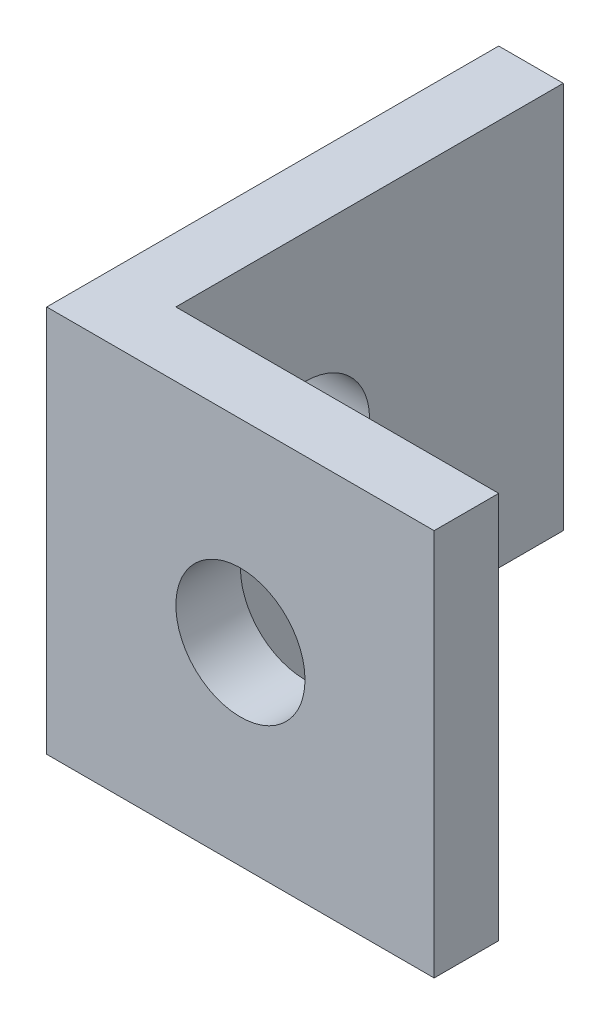
ISO-10303-21;
HEADER;
FILE_DESCRIPTION(('STEP AP214'),'2;1');
FILE_NAME('part.step','',(''),(''),'','','');
FILE_SCHEMA(('AUTOMOTIVE_DESIGN { 1 0 10303 214 1 1 1 1 }'));
ENDSEC;
DATA;
#1=APPLICATION_CONTEXT('core data for automotive mechanical design processes');
#2=APPLICATION_PROTOCOL_DEFINITION('international standard','automotive_design',2000,#1);
#3=PRODUCT_CONTEXT('',#1,'mechanical');
#4=PRODUCT('Part','Part','',(#3));
#5=PRODUCT_RELATED_PRODUCT_CATEGORY('part','',(#4));
#6=PRODUCT_DEFINITION_FORMATION('','',#4);
#7=PRODUCT_DEFINITION_CONTEXT('part definition',#1,'design');
#8=PRODUCT_DEFINITION('design','',#6,#7);
#9=PRODUCT_DEFINITION_SHAPE('','',#8);
#10=(LENGTH_UNIT() NAMED_UNIT(*) SI_UNIT(.MILLI.,.METRE.));
#11=(NAMED_UNIT(*) PLANE_ANGLE_UNIT() SI_UNIT($,.RADIAN.));
#12=(NAMED_UNIT(*) SI_UNIT($,.STERADIAN.) SOLID_ANGLE_UNIT());
#13=UNCERTAINTY_MEASURE_WITH_UNIT(LENGTH_MEASURE(1.E-05),#10,'distance_accuracy_value','');
#14=(GEOMETRIC_REPRESENTATION_CONTEXT(3) GLOBAL_UNCERTAINTY_ASSIGNED_CONTEXT((#13)) GLOBAL_UNIT_ASSIGNED_CONTEXT((#10,
#11,#12)) REPRESENTATION_CONTEXT('',''));
#15=CARTESIAN_POINT('',(0.,0.,0.));
#16=DIRECTION('',(0.,0.,1.));
#17=DIRECTION('',(1.,0.,0.));
#18=AXIS2_PLACEMENT_3D('',#15,#16,#17);
#19=CARTESIAN_POINT('',(0.,30.,-32.5));
#20=DIRECTION('',(0.,0.,1.));
#21=DIRECTION('',(1.,0.,0.));
#22=AXIS2_PLACEMENT_3D('',#19,#20,#21);
#23=PLANE('',#22);
#24=DIRECTION('',(-1.,0.,0.));
#25=VECTOR('',#24,1.);
#26=CARTESIAN_POINT('',(0.,0.,-32.5));
#27=LINE('',#26,#25);
#28=CARTESIAN_POINT('',(-9.99999999999999,0.,-32.5));
#29=VERTEX_POINT('',#28);
#30=CARTESIAN_POINT('',(-15.,0.,-32.5));
#31=VERTEX_POINT('',#30);
#32=EDGE_CURVE('E120',#29,#31,#27,.T.);
#33=ORIENTED_EDGE('',*,*,#32,.T.);
#34=DIRECTION('',(0.,-1.,0.));
#35=VECTOR('',#34,1.);
#36=CARTESIAN_POINT('',(-15.,30.,-32.5));
#37=LINE('',#36,#35);
#38=CARTESIAN_POINT('',(-15.,30.,-32.5));
#39=VERTEX_POINT('',#38);
#40=EDGE_CURVE('E11',#39,#31,#37,.T.);
#41=ORIENTED_EDGE('',*,*,#40,.F.);
#42=DIRECTION('',(-1.,0.,0.));
#43=VECTOR('',#42,1.);
#44=CARTESIAN_POINT('',(0.,30.,-32.5));
#45=LINE('',#44,#43);
#46=CARTESIAN_POINT('',(-9.99999999999999,30.,-32.5));
#47=VERTEX_POINT('',#46);
#48=EDGE_CURVE('E133',#47,#39,#45,.T.);
#49=ORIENTED_EDGE('',*,*,#48,.F.);
#50=DIRECTION('',(0.,-1.,0.));
#51=VECTOR('',#50,1.);
#52=CARTESIAN_POINT('',(-9.99999999999999,30.,-32.5));
#53=LINE('',#52,#51);
#54=EDGE_CURVE('E51',#47,#29,#53,.T.);
#55=ORIENTED_EDGE('',*,*,#54,.T.);
#56=EDGE_LOOP('',(#33,#41,#49,#55));
#57=FACE_BOUND('',#56,.T.);
#58=ADVANCED_FACE('F35',(#57),#23,.F.);
#59=CARTESIAN_POINT('',(-15.,30.,0.));
#60=DIRECTION('',(1.,0.,0.));
#61=DIRECTION('',(0.,0.,-1.));
#62=AXIS2_PLACEMENT_3D('',#59,#60,#61);
#63=PLANE('',#62);
#64=CARTESIAN_POINT('',(-15.,15.,-12.5));
#65=DIRECTION('',(-1.,0.,0.));
#66=DIRECTION('',(0.,0.,1.));
#67=AXIS2_PLACEMENT_3D('',#64,#65,#66);
#68=CIRCLE('',#67,5.);
#69=CARTESIAN_POINT('',(-15.,15.,-7.5));
#70=VERTEX_POINT('',#69);
#71=EDGE_CURVE('E172',#70,#70,#68,.T.);
#72=ORIENTED_EDGE('',*,*,#71,.F.);
#73=EDGE_LOOP('',(#72));
#74=FACE_BOUND('',#73,.T.);
#75=DIRECTION('',(0.,0.,1.));
#76=VECTOR('',#75,1.);
#77=CARTESIAN_POINT('',(-15.,0.,0.));
#78=LINE('',#77,#76);
#79=CARTESIAN_POINT('',(-15.,0.,2.5));
#80=VERTEX_POINT('',#79);
#81=EDGE_CURVE('E122',#31,#80,#78,.T.);
#82=ORIENTED_EDGE('',*,*,#81,.T.);
#83=DIRECTION('',(0.,-1.,0.));
#84=VECTOR('',#83,1.);
#85=CARTESIAN_POINT('',(-15.,30.,2.5));
#86=LINE('',#85,#84);
#87=CARTESIAN_POINT('',(-15.,30.,2.5));
#88=VERTEX_POINT('',#87);
#89=EDGE_CURVE('E43',#88,#80,#86,.T.);
#90=ORIENTED_EDGE('',*,*,#89,.F.);
#91=DIRECTION('',(0.,0.,1.));
#92=VECTOR('',#91,1.);
#93=CARTESIAN_POINT('',(-15.,30.,0.));
#94=LINE('',#93,#92);
#95=EDGE_CURVE('E83',#39,#88,#94,.T.);
#96=ORIENTED_EDGE('',*,*,#95,.F.);
#97=ORIENTED_EDGE('',*,*,#40,.T.);
#98=EDGE_LOOP('',(#82,#90,#96,#97));
#99=FACE_BOUND('',#98,.T.);
#100=ADVANCED_FACE('F156',(#74,#99),#63,.F.);
#101=CARTESIAN_POINT('',(0.,30.,2.5));
#102=DIRECTION('',(0.,0.,-1.));
#103=DIRECTION('',(-1.,0.,0.));
#104=AXIS2_PLACEMENT_3D('',#101,#102,#103);
#105=PLANE('',#104);
#106=CARTESIAN_POINT('',(0.,15.,2.5));
#107=DIRECTION('',(0.,0.,1.));
#108=DIRECTION('',(1.,0.,0.));
#109=AXIS2_PLACEMENT_3D('',#106,#107,#108);
#110=CIRCLE('',#109,5.);
#111=CARTESIAN_POINT('',(4.99999999999999,15.,2.5));
#112=VERTEX_POINT('',#111);
#113=EDGE_CURVE('E167',#112,#112,#110,.T.);
#114=ORIENTED_EDGE('',*,*,#113,.F.);
#115=EDGE_LOOP('',(#114));
#116=FACE_BOUND('',#115,.T.);
#117=DIRECTION('',(1.,0.,0.));
#118=VECTOR('',#117,1.);
#119=CARTESIAN_POINT('',(0.,0.,2.5));
#120=LINE('',#119,#118);
#121=CARTESIAN_POINT('',(15.,0.,2.5));
#122=VERTEX_POINT('',#121);
#123=EDGE_CURVE('E125',#80,#122,#120,.T.);
#124=ORIENTED_EDGE('',*,*,#123,.T.);
#125=DIRECTION('',(0.,-1.,0.));
#126=VECTOR('',#125,1.);
#127=CARTESIAN_POINT('',(15.,30.,2.5));
#128=LINE('',#127,#126);
#129=CARTESIAN_POINT('',(15.,30.,2.5));
#130=VERTEX_POINT('',#129);
#131=EDGE_CURVE('E112',#130,#122,#128,.T.);
#132=ORIENTED_EDGE('',*,*,#131,.F.);
#133=DIRECTION('',(1.,0.,0.));
#134=VECTOR('',#133,1.);
#135=CARTESIAN_POINT('',(0.,30.,2.5));
#136=LINE('',#135,#134);
#137=EDGE_CURVE('E100',#88,#130,#136,.T.);
#138=ORIENTED_EDGE('',*,*,#137,.F.);
#139=ORIENTED_EDGE('',*,*,#89,.T.);
#140=EDGE_LOOP('',(#124,#132,#138,#139));
#141=FACE_BOUND('',#140,.T.);
#142=ADVANCED_FACE('F139',(#116,#141),#105,.F.);
#143=CARTESIAN_POINT('',(15.,30.,0.));
#144=DIRECTION('',(-1.,0.,0.));
#145=DIRECTION('',(0.,0.,1.));
#146=AXIS2_PLACEMENT_3D('',#143,#144,#145);
#147=PLANE('',#146);
#148=DIRECTION('',(0.,0.,-1.));
#149=VECTOR('',#148,1.);
#150=CARTESIAN_POINT('',(15.,0.,0.));
#151=LINE('',#150,#149);
#152=CARTESIAN_POINT('',(15.,0.,-2.5));
#153=VERTEX_POINT('',#152);
#154=EDGE_CURVE('E109',#122,#153,#151,.T.);
#155=ORIENTED_EDGE('',*,*,#154,.T.);
#156=DIRECTION('',(0.,-1.,0.));
#157=VECTOR('',#156,1.);
#158=CARTESIAN_POINT('',(15.,30.,-2.5));
#159=LINE('',#158,#157);
#160=CARTESIAN_POINT('',(15.,30.,-2.5));
#161=VERTEX_POINT('',#160);
#162=EDGE_CURVE('E106',#161,#153,#159,.T.);
#163=ORIENTED_EDGE('',*,*,#162,.F.);
#164=DIRECTION('',(0.,0.,-1.));
#165=VECTOR('',#164,1.);
#166=CARTESIAN_POINT('',(15.,30.,0.));
#167=LINE('',#166,#165);
#168=EDGE_CURVE('E93',#130,#161,#167,.T.);
#169=ORIENTED_EDGE('',*,*,#168,.F.);
#170=ORIENTED_EDGE('',*,*,#131,.T.);
#171=EDGE_LOOP('',(#155,#163,#169,#170));
#172=FACE_BOUND('',#171,.T.);
#173=ADVANCED_FACE('F107',(#172),#147,.F.);
#174=CARTESIAN_POINT('',(0.,30.,-2.5));
#175=DIRECTION('',(0.,0.,-1.));
#176=DIRECTION('',(-1.,0.,0.));
#177=AXIS2_PLACEMENT_3D('',#174,#175,#176);
#178=PLANE('',#177);
#179=CARTESIAN_POINT('',(0.,15.,-2.5));
#180=DIRECTION('',(0.,0.,-1.));
#181=DIRECTION('',(-1.,0.,0.));
#182=AXIS2_PLACEMENT_3D('',#179,#180,#181);
#183=CIRCLE('',#182,5.);
#184=CARTESIAN_POINT('',(-5.00000000000002,15.,-2.5));
#185=VERTEX_POINT('',#184);
#186=EDGE_CURVE('E123',#185,#185,#183,.F.);
#187=ORIENTED_EDGE('',*,*,#186,.T.);
#188=EDGE_LOOP('',(#187));
#189=FACE_BOUND('',#188,.T.);
#190=DIRECTION('',(1.,0.,0.));
#191=VECTOR('',#190,1.);
#192=CARTESIAN_POINT('',(0.,0.,-2.5));
#193=LINE('',#192,#191);
#194=CARTESIAN_POINT('',(-10.,0.,-2.5));
#195=VERTEX_POINT('',#194);
#196=EDGE_CURVE('E128',#195,#153,#193,.T.);
#197=ORIENTED_EDGE('',*,*,#196,.F.);
#198=DIRECTION('',(0.,-1.,0.));
#199=VECTOR('',#198,1.);
#200=CARTESIAN_POINT('',(-10.,30.,-2.5));
#201=LINE('',#200,#199);
#202=CARTESIAN_POINT('',(-10.,30.,-2.5));
#203=VERTEX_POINT('',#202);
#204=EDGE_CURVE('E71',#203,#195,#201,.T.);
#205=ORIENTED_EDGE('',*,*,#204,.F.);
#206=DIRECTION('',(1.,0.,0.));
#207=VECTOR('',#206,1.);
#208=CARTESIAN_POINT('',(0.,30.,-2.5));
#209=LINE('',#208,#207);
#210=EDGE_CURVE('E98',#203,#161,#209,.T.);
#211=ORIENTED_EDGE('',*,*,#210,.T.);
#212=ORIENTED_EDGE('',*,*,#162,.T.);
#213=EDGE_LOOP('',(#197,#205,#211,#212));
#214=FACE_BOUND('',#213,.T.);
#215=ADVANCED_FACE('F114',(#189,#214),#178,.T.);
#216=CARTESIAN_POINT('',(-10.,30.,0.));
#217=DIRECTION('',(1.,0.,0.));
#218=DIRECTION('',(0.,0.,-1.));
#219=AXIS2_PLACEMENT_3D('',#216,#217,#218);
#220=PLANE('',#219);
#221=CARTESIAN_POINT('',(-10.,15.,-12.5));
#222=DIRECTION('',(1.,0.,0.));
#223=DIRECTION('',(0.,0.,-1.));
#224=AXIS2_PLACEMENT_3D('',#221,#222,#223);
#225=CIRCLE('',#224,5.);
#226=CARTESIAN_POINT('',(-10.,15.,-17.5));
#227=VERTEX_POINT('',#226);
#228=EDGE_CURVE('E170',#227,#227,#225,.F.);
#229=ORIENTED_EDGE('',*,*,#228,.T.);
#230=EDGE_LOOP('',(#229));
#231=FACE_BOUND('',#230,.T.);
#232=DIRECTION('',(0.,0.,1.));
#233=VECTOR('',#232,1.);
#234=CARTESIAN_POINT('',(-10.,0.,0.));
#235=LINE('',#234,#233);
#236=EDGE_CURVE('E130',#29,#195,#235,.T.);
#237=ORIENTED_EDGE('',*,*,#236,.F.);
#238=ORIENTED_EDGE('',*,*,#54,.F.);
#239=DIRECTION('',(0.,0.,1.));
#240=VECTOR('',#239,1.);
#241=CARTESIAN_POINT('',(-10.,30.,0.));
#242=LINE('',#241,#240);
#243=EDGE_CURVE('E115',#47,#203,#242,.T.);
#244=ORIENTED_EDGE('',*,*,#243,.T.);
#245=ORIENTED_EDGE('',*,*,#204,.T.);
#246=EDGE_LOOP('',(#237,#238,#244,#245));
#247=FACE_BOUND('',#246,.T.);
#248=ADVANCED_FACE('F142',(#231,#247),#220,.T.);
#249=CARTESIAN_POINT('',(0.,30.,0.));
#250=DIRECTION('',(0.,1.,0.));
#251=DIRECTION('',(0.,0.,1.));
#252=AXIS2_PLACEMENT_3D('',#249,#250,#251);
#253=PLANE('',#252);
#254=ORIENTED_EDGE('',*,*,#48,.T.);
#255=ORIENTED_EDGE('',*,*,#95,.T.);
#256=ORIENTED_EDGE('',*,*,#137,.T.);
#257=ORIENTED_EDGE('',*,*,#168,.T.);
#258=ORIENTED_EDGE('',*,*,#210,.F.);
#259=ORIENTED_EDGE('',*,*,#243,.F.);
#260=EDGE_LOOP('',(#254,#255,#256,#257,#258,#259));
#261=FACE_BOUND('',#260,.T.);
#262=ADVANCED_FACE('F95',(#261),#253,.T.);
#263=CARTESIAN_POINT('',(0.,0.,0.));
#264=DIRECTION('',(0.,1.,0.));
#265=DIRECTION('',(0.,0.,1.));
#266=AXIS2_PLACEMENT_3D('',#263,#264,#265);
#267=PLANE('',#266);
#268=ORIENTED_EDGE('',*,*,#32,.F.);
#269=ORIENTED_EDGE('',*,*,#236,.T.);
#270=ORIENTED_EDGE('',*,*,#196,.T.);
#271=ORIENTED_EDGE('',*,*,#154,.F.);
#272=ORIENTED_EDGE('',*,*,#123,.F.);
#273=ORIENTED_EDGE('',*,*,#81,.F.);
#274=EDGE_LOOP('',(#268,#269,#270,#271,#272,#273));
#275=FACE_BOUND('',#274,.T.);
#276=ADVANCED_FACE('F141',(#275),#267,.F.);
#277=CARTESIAN_POINT('',(0.,15.,-16.642135623731));
#278=DIRECTION('',(0.,0.,1.));
#279=DIRECTION('',(1.,0.,0.));
#280=AXIS2_PLACEMENT_3D('',#277,#278,#279);
#281=CYLINDRICAL_SURFACE('',#280,5.);
#282=ORIENTED_EDGE('',*,*,#113,.T.);
#283=EDGE_LOOP('',(#282));
#284=FACE_BOUND('',#283,.T.);
#285=ORIENTED_EDGE('',*,*,#186,.F.);
#286=EDGE_LOOP('',(#285));
#287=FACE_BOUND('',#286,.T.);
#288=ADVANCED_FACE('F179',(#284,#287),#281,.F.);
#289=CARTESIAN_POINT('',(4.14213562373096,15.,-12.5));
#290=DIRECTION('',(-1.,0.,0.));
#291=DIRECTION('',(0.,0.,1.));
#292=AXIS2_PLACEMENT_3D('',#289,#290,#291);
#293=CYLINDRICAL_SURFACE('',#292,5.);
#294=ORIENTED_EDGE('',*,*,#71,.T.);
#295=EDGE_LOOP('',(#294));
#296=FACE_BOUND('',#295,.T.);
#297=ORIENTED_EDGE('',*,*,#228,.F.);
#298=EDGE_LOOP('',(#297));
#299=FACE_BOUND('',#298,.T.);
#300=ADVANCED_FACE('F176',(#296,#299),#293,.F.);
#301=CLOSED_SHELL('',(#58,#100,#142,#173,#215,#248,#262,#276,#288,#300));
#302=MANIFOLD_SOLID_BREP('B2',#301);
#303=ADVANCED_BREP_SHAPE_REPRESENTATION('',(#18,#302),#14);
#304=SHAPE_DEFINITION_REPRESENTATION(#9,#303);
ENDSEC;
END-ISO-10303-21;
